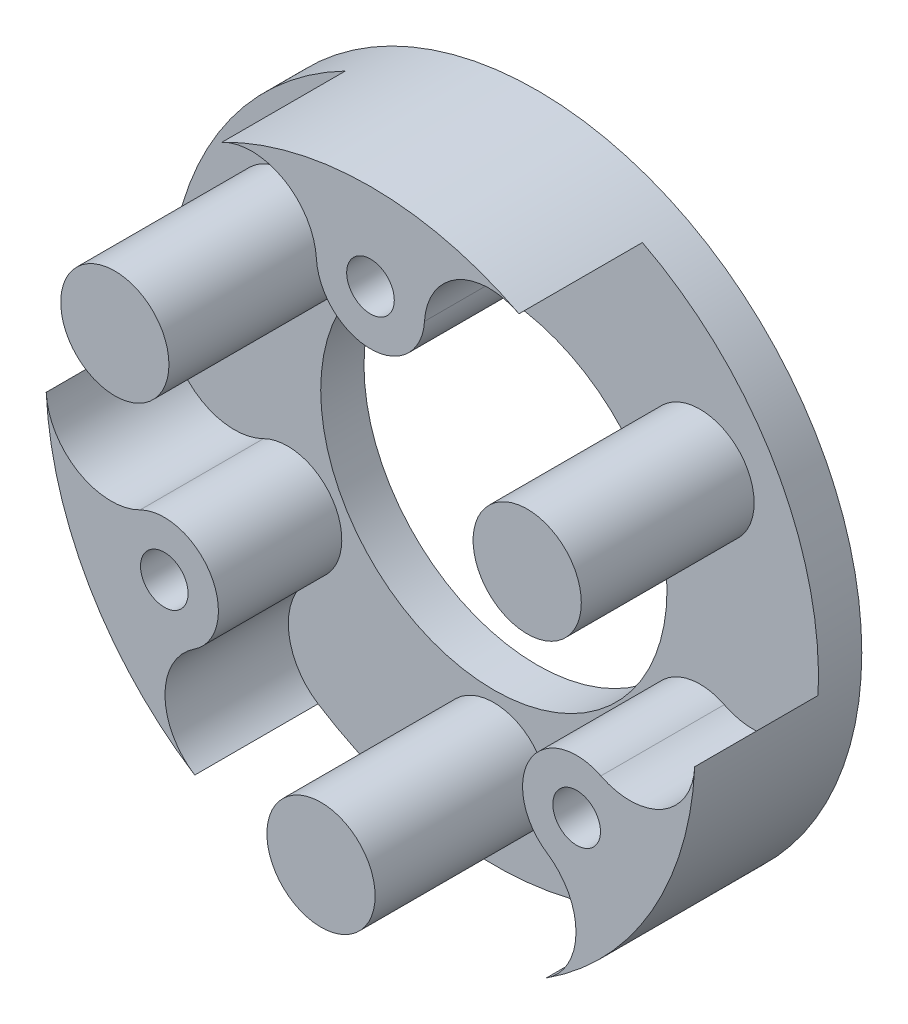
ISO-10303-21;
HEADER;
FILE_DESCRIPTION(('STEP AP214'),'2;1');
FILE_NAME('part.step','',(''),(''),'','','');
FILE_SCHEMA(('AUTOMOTIVE_DESIGN { 1 0 10303 214 1 1 1 1 }'));
ENDSEC;
DATA;
#1=APPLICATION_CONTEXT('core data for automotive mechanical design processes');
#2=APPLICATION_PROTOCOL_DEFINITION('international standard','automotive_design',2000,#1);
#3=PRODUCT_CONTEXT('',#1,'mechanical');
#4=PRODUCT('Part','Part','',(#3));
#5=PRODUCT_RELATED_PRODUCT_CATEGORY('part','',(#4));
#6=PRODUCT_DEFINITION_FORMATION('','',#4);
#7=PRODUCT_DEFINITION_CONTEXT('part definition',#1,'design');
#8=PRODUCT_DEFINITION('design','',#6,#7);
#9=PRODUCT_DEFINITION_SHAPE('','',#8);
#10=(LENGTH_UNIT() NAMED_UNIT(*) SI_UNIT(.MILLI.,.METRE.));
#11=(NAMED_UNIT(*) PLANE_ANGLE_UNIT() SI_UNIT($,.RADIAN.));
#12=(NAMED_UNIT(*) SI_UNIT($,.STERADIAN.) SOLID_ANGLE_UNIT());
#13=UNCERTAINTY_MEASURE_WITH_UNIT(LENGTH_MEASURE(1.E-05),#10,'distance_accuracy_value','');
#14=(GEOMETRIC_REPRESENTATION_CONTEXT(3) GLOBAL_UNCERTAINTY_ASSIGNED_CONTEXT((#13)) GLOBAL_UNIT_ASSIGNED_CONTEXT((#10,
#11,#12)) REPRESENTATION_CONTEXT('',''));
#15=CARTESIAN_POINT('',(0.,0.,0.));
#16=DIRECTION('',(0.,0.,1.));
#17=DIRECTION('',(1.,0.,0.));
#18=AXIS2_PLACEMENT_3D('',#15,#16,#17);
#19=CARTESIAN_POINT('',(0.,0.,2.));
#20=DIRECTION('',(0.,0.,1.));
#21=DIRECTION('',(1.,0.,0.));
#22=AXIS2_PLACEMENT_3D('',#19,#20,#21);
#23=PLANE('',#22);
#24=CARTESIAN_POINT('',(0.,-11.,2.));
#25=DIRECTION('',(0.,0.,1.));
#26=DIRECTION('',(1.,0.,0.));
#27=AXIS2_PLACEMENT_3D('',#24,#25,#26);
#28=CIRCLE('',#27,2.5);
#29=CARTESIAN_POINT('',(2.49999999999998,-11.,2.));
#30=VERTEX_POINT('',#29);
#31=EDGE_CURVE('E225',#30,#30,#28,.T.);
#32=ORIENTED_EDGE('',*,*,#31,.F.);
#33=EDGE_LOOP('',(#32));
#34=FACE_BOUND('',#33,.T.);
#35=CARTESIAN_POINT('',(9.52627944162884,5.49999999999998,2.));
#36=DIRECTION('',(0.,0.,1.));
#37=DIRECTION('',(1.,0.,0.));
#38=AXIS2_PLACEMENT_3D('',#35,#36,#37);
#39=CIRCLE('',#38,2.5);
#40=CARTESIAN_POINT('',(12.0262794416288,5.49999999999998,2.));
#41=VERTEX_POINT('',#40);
#42=EDGE_CURVE('E234',#41,#41,#39,.T.);
#43=ORIENTED_EDGE('',*,*,#42,.F.);
#44=EDGE_LOOP('',(#43));
#45=FACE_BOUND('',#44,.T.);
#46=CARTESIAN_POINT('',(-9.52627944162881,5.50000000000002,2.));
#47=DIRECTION('',(0.,0.,1.));
#48=DIRECTION('',(1.,0.,0.));
#49=AXIS2_PLACEMENT_3D('',#46,#47,#48);
#50=CIRCLE('',#49,2.5);
#51=CARTESIAN_POINT('',(-7.02627944162881,5.50000000000002,2.));
#52=VERTEX_POINT('',#51);
#53=EDGE_CURVE('E243',#52,#52,#50,.T.);
#54=ORIENTED_EDGE('',*,*,#53,.F.);
#55=EDGE_LOOP('',(#54));
#56=FACE_BOUND('',#55,.T.);
#57=CARTESIAN_POINT('',(0.,0.,2.));
#58=DIRECTION('',(0.,0.,1.));
#59=DIRECTION('',(1.,0.,0.));
#60=AXIS2_PLACEMENT_3D('',#57,#58,#59);
#61=CIRCLE('',#60,8.);
#62=CARTESIAN_POINT('',(8.,0.,2.));
#63=VERTEX_POINT('',#62);
#64=EDGE_CURVE('E262',#63,#63,#61,.T.);
#65=ORIENTED_EDGE('',*,*,#64,.F.);
#66=EDGE_LOOP('',(#65));
#67=FACE_BOUND('',#66,.T.);
#68=CARTESIAN_POINT('',(0.,0.,2.));
#69=DIRECTION('',(0.,0.,1.));
#70=DIRECTION('',(1.,0.,0.));
#71=AXIS2_PLACEMENT_3D('',#68,#69,#70);
#72=CIRCLE('',#71,15.);
#73=CARTESIAN_POINT('',(14.9824298684836,-0.725806610585195,2.));
#74=VERTEX_POINT('',#73);
#75=CARTESIAN_POINT('',(6.86264797124036,13.3380681818182,2.));
#76=VERTEX_POINT('',#75);
#77=EDGE_CURVE('E271',#74,#76,#72,.T.);
#78=ORIENTED_EDGE('',*,*,#77,.T.);
#79=CARTESIAN_POINT('',(5.49011837699229,10.6704545454545,2.));
#80=DIRECTION('',(0.,0.,1.));
#81=DIRECTION('',(1.,0.,0.));
#82=AXIS2_PLACEMENT_3D('',#79,#80,#81);
#83=CIRCLE('',#82,3.);
#84=CARTESIAN_POINT('',(2.49550835317831,10.8502066115702,2.));
#85=VERTEX_POINT('',#84);
#86=EDGE_CURVE('E60',#85,#76,#83,.F.);
#87=ORIENTED_EDGE('',*,*,#86,.F.);
#88=CARTESIAN_POINT('',(0.,11.,2.));
#89=DIRECTION('',(0.,0.,1.));
#90=DIRECTION('',(1.,0.,0.));
#91=AXIS2_PLACEMENT_3D('',#88,#89,#90);
#92=CIRCLE('',#91,2.5);
#93=CARTESIAN_POINT('',(-2.49550835317831,10.8502066115702,2.));
#94=VERTEX_POINT('',#93);
#95=EDGE_CURVE('E65',#94,#85,#92,.T.);
#96=ORIENTED_EDGE('',*,*,#95,.F.);
#97=CARTESIAN_POINT('',(-5.49011837699229,10.6704545454545,2.));
#98=DIRECTION('',(0.,0.,1.));
#99=DIRECTION('',(1.,0.,0.));
#100=AXIS2_PLACEMENT_3D('',#97,#98,#99);
#101=CIRCLE('',#100,3.);
#102=CARTESIAN_POINT('',(-6.86264797124036,13.3380681818182,2.));
#103=VERTEX_POINT('',#102);
#104=EDGE_CURVE('E320',#94,#103,#101,.T.);
#105=ORIENTED_EDGE('',*,*,#104,.T.);
#106=CARTESIAN_POINT('',(-14.9824298684836,-0.725806610585196,2.));
#107=VERTEX_POINT('',#106);
#108=EDGE_CURVE('E272',#103,#107,#72,.T.);
#109=ORIENTED_EDGE('',*,*,#108,.T.);
#110=CARTESIAN_POINT('',(-11.9859438947869,-0.580645288468157,2.));
#111=DIRECTION('',(0.,0.,1.));
#112=DIRECTION('',(1.,0.,0.));
#113=AXIS2_PLACEMENT_3D('',#110,#111,#112);
#114=CIRCLE('',#113,3.);
#115=CARTESIAN_POINT('',(-10.6443087385189,-3.26392967657644,2.));
#116=VERTEX_POINT('',#115);
#117=EDGE_CURVE('E197',#116,#107,#114,.F.);
#118=ORIENTED_EDGE('',*,*,#117,.F.);
#119=CARTESIAN_POINT('',(-9.52627944162882,-5.50000000000001,2.));
#120=DIRECTION('',(0.,0.,1.));
#121=DIRECTION('',(1.,0.,0.));
#122=AXIS2_PLACEMENT_3D('',#119,#120,#121);
#123=CIRCLE('',#122,2.5);
#124=CARTESIAN_POINT('',(-8.14880038534055,-7.58627693499382,2.));
#125=VERTEX_POINT('',#124);
#126=EDGE_CURVE('E209',#125,#116,#123,.T.);
#127=ORIENTED_EDGE('',*,*,#126,.F.);
#128=CARTESIAN_POINT('',(-6.49582551779463,-10.0898092569864,2.));
#129=DIRECTION('',(0.,0.,1.));
#130=DIRECTION('',(1.,0.,0.));
#131=AXIS2_PLACEMENT_3D('',#128,#129,#130);
#132=CIRCLE('',#131,3.);
#133=CARTESIAN_POINT('',(-8.11978189724329,-12.612261571233,2.));
#134=VERTEX_POINT('',#133);
#135=EDGE_CURVE('E192',#125,#134,#132,.T.);
#136=ORIENTED_EDGE('',*,*,#135,.T.);
#137=CARTESIAN_POINT('',(8.11978189724329,-12.612261571233,2.));
#138=VERTEX_POINT('',#137);
#139=EDGE_CURVE('E268',#134,#138,#72,.T.);
#140=ORIENTED_EDGE('',*,*,#139,.T.);
#141=CARTESIAN_POINT('',(6.49582551779463,-10.0898092569864,2.));
#142=DIRECTION('',(0.,0.,1.));
#143=DIRECTION('',(1.,0.,0.));
#144=AXIS2_PLACEMENT_3D('',#141,#142,#143);
#145=CIRCLE('',#144,3.);
#146=CARTESIAN_POINT('',(8.14880038534056,-7.58627693499381,2.));
#147=VERTEX_POINT('',#146);
#148=EDGE_CURVE('E167',#147,#138,#145,.F.);
#149=ORIENTED_EDGE('',*,*,#148,.F.);
#150=CARTESIAN_POINT('',(9.52627944162883,-5.5,2.));
#151=DIRECTION('',(0.,0.,1.));
#152=DIRECTION('',(1.,0.,0.));
#153=AXIS2_PLACEMENT_3D('',#150,#151,#152);
#154=CIRCLE('',#153,2.5);
#155=CARTESIAN_POINT('',(10.6443087385189,-3.26392967657643,2.));
#156=VERTEX_POINT('',#155);
#157=EDGE_CURVE('E157',#156,#147,#154,.T.);
#158=ORIENTED_EDGE('',*,*,#157,.F.);
#159=CARTESIAN_POINT('',(11.9859438947869,-0.580645288468156,2.));
#160=DIRECTION('',(0.,0.,1.));
#161=DIRECTION('',(1.,0.,0.));
#162=AXIS2_PLACEMENT_3D('',#159,#160,#161);
#163=CIRCLE('',#162,3.);
#164=EDGE_CURVE('E154',#156,#74,#163,.T.);
#165=ORIENTED_EDGE('',*,*,#164,.T.);
#166=EDGE_LOOP('',(#78,#87,#96,#105,#109,#118,#127,#136,#140,#149,#158,#165));
#167=FACE_BOUND('',#166,.T.);
#168=ADVANCED_FACE('F45',(#34,#45,#56,#67,#167),#23,.T.);
#169=CARTESIAN_POINT('',(0.,0.,0.));
#170=DIRECTION('',(0.,0.,1.));
#171=DIRECTION('',(1.,0.,0.));
#172=AXIS2_PLACEMENT_3D('',#169,#170,#171);
#173=PLANE('',#172);
#174=CARTESIAN_POINT('',(0.,0.,0.));
#175=DIRECTION('',(0.,0.,1.));
#176=DIRECTION('',(1.,0.,0.));
#177=AXIS2_PLACEMENT_3D('',#174,#175,#176);
#178=CIRCLE('',#177,15.);
#179=CARTESIAN_POINT('',(15.,0.,0.));
#180=VERTEX_POINT('',#179);
#181=EDGE_CURVE('E265',#180,#180,#178,.T.);
#182=ORIENTED_EDGE('',*,*,#181,.F.);
#183=EDGE_LOOP('',(#182));
#184=FACE_BOUND('',#183,.T.);
#185=CARTESIAN_POINT('',(0.,0.,0.));
#186=DIRECTION('',(0.,0.,1.));
#187=DIRECTION('',(1.,0.,0.));
#188=AXIS2_PLACEMENT_3D('',#185,#186,#187);
#189=CIRCLE('',#188,8.);
#190=CARTESIAN_POINT('',(8.,0.,0.));
#191=VERTEX_POINT('',#190);
#192=EDGE_CURVE('E261',#191,#191,#189,.T.);
#193=ORIENTED_EDGE('',*,*,#192,.T.);
#194=EDGE_LOOP('',(#193));
#195=FACE_BOUND('',#194,.T.);
#196=CARTESIAN_POINT('',(9.52627944162884,5.49999999999998,0.));
#197=DIRECTION('',(0.,0.,1.));
#198=DIRECTION('',(1.,0.,0.));
#199=AXIS2_PLACEMENT_3D('',#196,#197,#198);
#200=CIRCLE('',#199,1.5);
#201=CARTESIAN_POINT('',(11.0262794416288,5.49999999999998,0.));
#202=VERTEX_POINT('',#201);
#203=EDGE_CURVE('E258',#202,#202,#200,.T.);
#204=ORIENTED_EDGE('',*,*,#203,.T.);
#205=EDGE_LOOP('',(#204));
#206=FACE_BOUND('',#205,.T.);
#207=CARTESIAN_POINT('',(0.,-11.,0.));
#208=DIRECTION('',(0.,0.,1.));
#209=DIRECTION('',(1.,0.,0.));
#210=AXIS2_PLACEMENT_3D('',#207,#208,#209);
#211=CIRCLE('',#210,1.5);
#212=CARTESIAN_POINT('',(1.49999999999998,-11.,0.));
#213=VERTEX_POINT('',#212);
#214=EDGE_CURVE('E255',#213,#213,#211,.T.);
#215=ORIENTED_EDGE('',*,*,#214,.T.);
#216=EDGE_LOOP('',(#215));
#217=FACE_BOUND('',#216,.T.);
#218=CARTESIAN_POINT('',(-9.52627944162881,5.50000000000002,0.));
#219=DIRECTION('',(0.,0.,1.));
#220=DIRECTION('',(1.,0.,0.));
#221=AXIS2_PLACEMENT_3D('',#218,#219,#220);
#222=CIRCLE('',#221,1.5);
#223=CARTESIAN_POINT('',(-8.02627944162881,5.50000000000002,0.));
#224=VERTEX_POINT('',#223);
#225=EDGE_CURVE('E252',#224,#224,#222,.T.);
#226=ORIENTED_EDGE('',*,*,#225,.T.);
#227=EDGE_LOOP('',(#226));
#228=FACE_BOUND('',#227,.T.);
#229=ADVANCED_FACE('F302',(#184,#195,#206,#217,#228),#173,.F.);
#230=CARTESIAN_POINT('',(0.,0.,2.));
#231=DIRECTION('',(0.,0.,-1.));
#232=DIRECTION('',(-1.,0.,0.));
#233=AXIS2_PLACEMENT_3D('',#230,#231,#232);
#234=CYLINDRICAL_SURFACE('',#233,15.);
#235=ORIENTED_EDGE('',*,*,#139,.F.);
#236=DIRECTION('',(0.,0.,-1.));
#237=VECTOR('',#236,1.);
#238=CARTESIAN_POINT('',(-8.11978189724329,-12.612261571233,7.7));
#239=LINE('',#238,#237);
#240=CARTESIAN_POINT('',(-8.11978189724329,-12.612261571233,7.7));
#241=VERTEX_POINT('',#240);
#242=EDGE_CURVE('E206',#241,#134,#239,.T.);
#243=ORIENTED_EDGE('',*,*,#242,.F.);
#244=CARTESIAN_POINT('',(0.,0.,7.7));
#245=DIRECTION('',(0.,0.,1.));
#246=DIRECTION('',(1.,0.,0.));
#247=AXIS2_PLACEMENT_3D('',#244,#245,#246);
#248=CIRCLE('',#247,15.);
#249=CARTESIAN_POINT('',(-14.9824298684836,-0.725806610585196,7.7));
#250=VERTEX_POINT('',#249);
#251=EDGE_CURVE('E201',#250,#241,#248,.T.);
#252=ORIENTED_EDGE('',*,*,#251,.F.);
#253=DIRECTION('',(0.,0.,-1.));
#254=VECTOR('',#253,1.);
#255=CARTESIAN_POINT('',(-14.9824298684836,-0.725806610585196,7.7));
#256=LINE('',#255,#254);
#257=EDGE_CURVE('E216',#250,#107,#256,.T.);
#258=ORIENTED_EDGE('',*,*,#257,.T.);
#259=ORIENTED_EDGE('',*,*,#108,.F.);
#260=DIRECTION('',(0.,0.,-1.));
#261=VECTOR('',#260,1.);
#262=CARTESIAN_POINT('',(-6.86264797124036,13.3380681818182,7.7));
#263=LINE('',#262,#261);
#264=CARTESIAN_POINT('',(-6.86264797124036,13.3380681818182,7.7));
#265=VERTEX_POINT('',#264);
#266=EDGE_CURVE('E159',#265,#103,#263,.T.);
#267=ORIENTED_EDGE('',*,*,#266,.F.);
#268=CARTESIAN_POINT('',(0.,0.,7.7));
#269=DIRECTION('',(0.,0.,1.));
#270=DIRECTION('',(1.,0.,0.));
#271=AXIS2_PLACEMENT_3D('',#268,#269,#270);
#272=CIRCLE('',#271,15.);
#273=CARTESIAN_POINT('',(6.86264797124036,13.3380681818182,7.7));
#274=VERTEX_POINT('',#273);
#275=EDGE_CURVE('E142',#274,#265,#272,.T.);
#276=ORIENTED_EDGE('',*,*,#275,.F.);
#277=DIRECTION('',(0.,0.,-1.));
#278=VECTOR('',#277,1.);
#279=CARTESIAN_POINT('',(6.86264797124036,13.3380681818182,7.7));
#280=LINE('',#279,#278);
#281=EDGE_CURVE('E139',#274,#76,#280,.T.);
#282=ORIENTED_EDGE('',*,*,#281,.T.);
#283=ORIENTED_EDGE('',*,*,#77,.F.);
#284=DIRECTION('',(0.,0.,-1.));
#285=VECTOR('',#284,1.);
#286=CARTESIAN_POINT('',(14.9824298684836,-0.725806610585195,7.7));
#287=LINE('',#286,#285);
#288=CARTESIAN_POINT('',(14.9824298684836,-0.725806610585195,7.7));
#289=VERTEX_POINT('',#288);
#290=EDGE_CURVE('E175',#289,#74,#287,.T.);
#291=ORIENTED_EDGE('',*,*,#290,.F.);
#292=CARTESIAN_POINT('',(0.,0.,7.7));
#293=DIRECTION('',(0.,0.,1.));
#294=DIRECTION('',(1.,0.,0.));
#295=AXIS2_PLACEMENT_3D('',#292,#293,#294);
#296=CIRCLE('',#295,15.);
#297=CARTESIAN_POINT('',(8.11978189724329,-12.612261571233,7.7));
#298=VERTEX_POINT('',#297);
#299=EDGE_CURVE('E171',#298,#289,#296,.T.);
#300=ORIENTED_EDGE('',*,*,#299,.F.);
#301=DIRECTION('',(0.,0.,-1.));
#302=VECTOR('',#301,1.);
#303=CARTESIAN_POINT('',(8.11978189724329,-12.612261571233,7.7));
#304=LINE('',#303,#302);
#305=EDGE_CURVE('E183',#298,#138,#304,.T.);
#306=ORIENTED_EDGE('',*,*,#305,.T.);
#307=EDGE_LOOP('',(#235,#243,#252,#258,#259,#267,#276,#282,#283,#291,#300,#306));
#308=FACE_BOUND('',#307,.T.);
#309=ORIENTED_EDGE('',*,*,#181,.T.);
#310=EDGE_LOOP('',(#309));
#311=FACE_BOUND('',#310,.T.);
#312=ADVANCED_FACE('F47',(#308,#311),#234,.T.);
#313=CARTESIAN_POINT('',(0.,0.,2.));
#314=DIRECTION('',(0.,0.,-1.));
#315=DIRECTION('',(-1.,0.,0.));
#316=AXIS2_PLACEMENT_3D('',#313,#314,#315);
#317=CYLINDRICAL_SURFACE('',#316,8.);
#318=ORIENTED_EDGE('',*,*,#64,.T.);
#319=EDGE_LOOP('',(#318));
#320=FACE_BOUND('',#319,.T.);
#321=ORIENTED_EDGE('',*,*,#192,.F.);
#322=EDGE_LOOP('',(#321));
#323=FACE_BOUND('',#322,.T.);
#324=ADVANCED_FACE('F403',(#320,#323),#317,.F.);
#325=CARTESIAN_POINT('',(9.52627944162884,5.49999999999998,2.));
#326=DIRECTION('',(0.,0.,-1.));
#327=DIRECTION('',(-1.,0.,0.));
#328=AXIS2_PLACEMENT_3D('',#325,#326,#327);
#329=CYLINDRICAL_SURFACE('',#328,1.5);
#330=CARTESIAN_POINT('',(9.52627944162884,5.49999999999998,2.));
#331=DIRECTION('',(0.,0.,1.));
#332=DIRECTION('',(1.,0.,0.));
#333=AXIS2_PLACEMENT_3D('',#330,#331,#332);
#334=CIRCLE('',#333,1.5);
#335=CARTESIAN_POINT('',(11.0262794416288,5.49999999999998,2.));
#336=VERTEX_POINT('',#335);
#337=EDGE_CURVE('E238',#336,#336,#334,.T.);
#338=ORIENTED_EDGE('',*,*,#337,.T.);
#339=EDGE_LOOP('',(#338));
#340=FACE_BOUND('',#339,.T.);
#341=ORIENTED_EDGE('',*,*,#203,.F.);
#342=EDGE_LOOP('',(#341));
#343=FACE_BOUND('',#342,.T.);
#344=ADVANCED_FACE('F400',(#340,#343),#329,.F.);
#345=CARTESIAN_POINT('',(0.,-11.,2.));
#346=DIRECTION('',(0.,0.,-1.));
#347=DIRECTION('',(-1.,0.,0.));
#348=AXIS2_PLACEMENT_3D('',#345,#346,#347);
#349=CYLINDRICAL_SURFACE('',#348,1.5);
#350=CARTESIAN_POINT('',(0.,-11.,2.));
#351=DIRECTION('',(0.,0.,1.));
#352=DIRECTION('',(1.,0.,0.));
#353=AXIS2_PLACEMENT_3D('',#350,#351,#352);
#354=CIRCLE('',#353,1.5);
#355=CARTESIAN_POINT('',(1.49999999999998,-11.,2.));
#356=VERTEX_POINT('',#355);
#357=EDGE_CURVE('E229',#356,#356,#354,.T.);
#358=ORIENTED_EDGE('',*,*,#357,.T.);
#359=EDGE_LOOP('',(#358));
#360=FACE_BOUND('',#359,.T.);
#361=ORIENTED_EDGE('',*,*,#214,.F.);
#362=EDGE_LOOP('',(#361));
#363=FACE_BOUND('',#362,.T.);
#364=ADVANCED_FACE('F396',(#360,#363),#349,.F.);
#365=CARTESIAN_POINT('',(-9.52627944162881,5.50000000000002,2.));
#366=DIRECTION('',(0.,0.,-1.));
#367=DIRECTION('',(-1.,0.,0.));
#368=AXIS2_PLACEMENT_3D('',#365,#366,#367);
#369=CYLINDRICAL_SURFACE('',#368,1.5);
#370=CARTESIAN_POINT('',(-9.52627944162881,5.50000000000002,2.));
#371=DIRECTION('',(0.,0.,1.));
#372=DIRECTION('',(1.,0.,0.));
#373=AXIS2_PLACEMENT_3D('',#370,#371,#372);
#374=CIRCLE('',#373,1.5);
#375=CARTESIAN_POINT('',(-8.02627944162881,5.50000000000002,2.));
#376=VERTEX_POINT('',#375);
#377=EDGE_CURVE('E247',#376,#376,#374,.T.);
#378=ORIENTED_EDGE('',*,*,#377,.T.);
#379=EDGE_LOOP('',(#378));
#380=FACE_BOUND('',#379,.T.);
#381=ORIENTED_EDGE('',*,*,#225,.F.);
#382=EDGE_LOOP('',(#381));
#383=FACE_BOUND('',#382,.T.);
#384=ADVANCED_FACE('F389',(#380,#383),#369,.F.);
#385=CARTESIAN_POINT('',(0.,0.,2.));
#386=DIRECTION('',(0.,0.,1.));
#387=DIRECTION('',(1.,0.,0.));
#388=AXIS2_PLACEMENT_3D('',#385,#386,#387);
#389=PLANE('',#388);
#390=ORIENTED_EDGE('',*,*,#377,.F.);
#391=EDGE_LOOP('',(#390));
#392=FACE_BOUND('',#391,.T.);
#393=ADVANCED_FACE('F386',(#392),#389,.F.);
#394=CARTESIAN_POINT('',(-9.52627944162881,5.50000000000002,9.98561911570283));
#395=DIRECTION('',(0.,0.,-1.));
#396=DIRECTION('',(-1.,0.,0.));
#397=AXIS2_PLACEMENT_3D('',#394,#395,#396);
#398=CYLINDRICAL_SURFACE('',#397,2.5);
#399=CARTESIAN_POINT('',(-9.52627944162881,5.50000000000002,9.98561911570283));
#400=DIRECTION('',(0.,0.,1.));
#401=DIRECTION('',(1.,0.,0.));
#402=AXIS2_PLACEMENT_3D('',#399,#400,#401);
#403=CIRCLE('',#402,2.5);
#404=CARTESIAN_POINT('',(-7.02627944162881,5.50000000000002,9.98561911570283));
#405=VERTEX_POINT('',#404);
#406=EDGE_CURVE('E244',#405,#405,#403,.T.);
#407=ORIENTED_EDGE('',*,*,#406,.F.);
#408=EDGE_LOOP('',(#407));
#409=FACE_BOUND('',#408,.T.);
#410=ORIENTED_EDGE('',*,*,#53,.T.);
#411=EDGE_LOOP('',(#410));
#412=FACE_BOUND('',#411,.T.);
#413=ADVANCED_FACE('F384',(#409,#412),#398,.T.);
#414=CARTESIAN_POINT('',(0.,0.,9.98561911570283));
#415=DIRECTION('',(0.,0.,1.));
#416=DIRECTION('',(1.,0.,0.));
#417=AXIS2_PLACEMENT_3D('',#414,#415,#416);
#418=PLANE('',#417);
#419=ORIENTED_EDGE('',*,*,#406,.T.);
#420=EDGE_LOOP('',(#419));
#421=FACE_BOUND('',#420,.T.);
#422=ADVANCED_FACE('F377',(#421),#418,.T.);
#423=CARTESIAN_POINT('',(0.,0.,2.));
#424=DIRECTION('',(0.,0.,1.));
#425=DIRECTION('',(1.,0.,0.));
#426=AXIS2_PLACEMENT_3D('',#423,#424,#425);
#427=PLANE('',#426);
#428=ORIENTED_EDGE('',*,*,#337,.F.);
#429=EDGE_LOOP('',(#428));
#430=FACE_BOUND('',#429,.T.);
#431=ADVANCED_FACE('F374',(#430),#427,.F.);
#432=CARTESIAN_POINT('',(9.52627944162884,5.49999999999998,9.98561911570283));
#433=DIRECTION('',(0.,0.,-1.));
#434=DIRECTION('',(-1.,0.,0.));
#435=AXIS2_PLACEMENT_3D('',#432,#433,#434);
#436=CYLINDRICAL_SURFACE('',#435,2.5);
#437=CARTESIAN_POINT('',(9.52627944162884,5.49999999999998,9.98561911570283));
#438=DIRECTION('',(0.,0.,1.));
#439=DIRECTION('',(1.,0.,0.));
#440=AXIS2_PLACEMENT_3D('',#437,#438,#439);
#441=CIRCLE('',#440,2.5);
#442=CARTESIAN_POINT('',(12.0262794416288,5.49999999999998,9.98561911570283));
#443=VERTEX_POINT('',#442);
#444=EDGE_CURVE('E235',#443,#443,#441,.T.);
#445=ORIENTED_EDGE('',*,*,#444,.F.);
#446=EDGE_LOOP('',(#445));
#447=FACE_BOUND('',#446,.T.);
#448=ORIENTED_EDGE('',*,*,#42,.T.);
#449=EDGE_LOOP('',(#448));
#450=FACE_BOUND('',#449,.T.);
#451=ADVANCED_FACE('F372',(#447,#450),#436,.T.);
#452=CARTESIAN_POINT('',(0.,0.,9.98561911570283));
#453=DIRECTION('',(0.,0.,1.));
#454=DIRECTION('',(1.,0.,0.));
#455=AXIS2_PLACEMENT_3D('',#452,#453,#454);
#456=PLANE('',#455);
#457=ORIENTED_EDGE('',*,*,#444,.T.);
#458=EDGE_LOOP('',(#457));
#459=FACE_BOUND('',#458,.T.);
#460=ADVANCED_FACE('F365',(#459),#456,.T.);
#461=CARTESIAN_POINT('',(0.,0.,2.));
#462=DIRECTION('',(0.,0.,1.));
#463=DIRECTION('',(1.,0.,0.));
#464=AXIS2_PLACEMENT_3D('',#461,#462,#463);
#465=PLANE('',#464);
#466=ORIENTED_EDGE('',*,*,#357,.F.);
#467=EDGE_LOOP('',(#466));
#468=FACE_BOUND('',#467,.T.);
#469=ADVANCED_FACE('F362',(#468),#465,.F.);
#470=CARTESIAN_POINT('',(0.,-11.,9.98561911570283));
#471=DIRECTION('',(0.,0.,-1.));
#472=DIRECTION('',(-1.,0.,0.));
#473=AXIS2_PLACEMENT_3D('',#470,#471,#472);
#474=CYLINDRICAL_SURFACE('',#473,2.5);
#475=CARTESIAN_POINT('',(0.,-11.,9.98561911570283));
#476=DIRECTION('',(0.,0.,1.));
#477=DIRECTION('',(1.,0.,0.));
#478=AXIS2_PLACEMENT_3D('',#475,#476,#477);
#479=CIRCLE('',#478,2.5);
#480=CARTESIAN_POINT('',(2.49999999999998,-11.,9.98561911570283));
#481=VERTEX_POINT('',#480);
#482=EDGE_CURVE('E226',#481,#481,#479,.T.);
#483=ORIENTED_EDGE('',*,*,#482,.F.);
#484=EDGE_LOOP('',(#483));
#485=FACE_BOUND('',#484,.T.);
#486=ORIENTED_EDGE('',*,*,#31,.T.);
#487=EDGE_LOOP('',(#486));
#488=FACE_BOUND('',#487,.T.);
#489=ADVANCED_FACE('F357',(#485,#488),#474,.T.);
#490=CARTESIAN_POINT('',(0.,0.,9.98561911570283));
#491=DIRECTION('',(0.,0.,1.));
#492=DIRECTION('',(1.,0.,0.));
#493=AXIS2_PLACEMENT_3D('',#490,#491,#492);
#494=PLANE('',#493);
#495=ORIENTED_EDGE('',*,*,#482,.T.);
#496=EDGE_LOOP('',(#495));
#497=FACE_BOUND('',#496,.T.);
#498=ADVANCED_FACE('F351',(#497),#494,.T.);
#499=CARTESIAN_POINT('',(-6.49582551779463,-10.0898092569864,7.7));
#500=DIRECTION('',(0.,0.,-1.));
#501=DIRECTION('',(-1.,0.,0.));
#502=AXIS2_PLACEMENT_3D('',#499,#500,#501);
#503=CYLINDRICAL_SURFACE('',#502,3.);
#504=ORIENTED_EDGE('',*,*,#135,.F.);
#505=DIRECTION('',(0.,0.,-1.));
#506=VECTOR('',#505,1.);
#507=CARTESIAN_POINT('',(-8.14880038534055,-7.58627693499382,7.7));
#508=LINE('',#507,#506);
#509=CARTESIAN_POINT('',(-8.14880038534055,-7.58627693499382,7.7));
#510=VERTEX_POINT('',#509);
#511=EDGE_CURVE('E222',#510,#125,#508,.T.);
#512=ORIENTED_EDGE('',*,*,#511,.F.);
#513=CARTESIAN_POINT('',(-6.49582551779463,-10.0898092569864,7.7));
#514=DIRECTION('',(0.,0.,1.));
#515=DIRECTION('',(1.,0.,0.));
#516=AXIS2_PLACEMENT_3D('',#513,#514,#515);
#517=CIRCLE('',#516,3.);
#518=EDGE_CURVE('E193',#510,#241,#517,.T.);
#519=ORIENTED_EDGE('',*,*,#518,.T.);
#520=ORIENTED_EDGE('',*,*,#242,.T.);
#521=EDGE_LOOP('',(#504,#512,#519,#520));
#522=FACE_BOUND('',#521,.T.);
#523=ADVANCED_FACE('F349',(#522),#503,.F.);
#524=CARTESIAN_POINT('',(-9.52627944162882,-5.50000000000001,7.7));
#525=DIRECTION('',(0.,0.,-1.));
#526=DIRECTION('',(-1.,0.,0.));
#527=AXIS2_PLACEMENT_3D('',#524,#525,#526);
#528=CYLINDRICAL_SURFACE('',#527,2.5);
#529=ORIENTED_EDGE('',*,*,#126,.T.);
#530=DIRECTION('',(0.,0.,-1.));
#531=VECTOR('',#530,1.);
#532=CARTESIAN_POINT('',(-10.6443087385189,-3.26392967657644,7.7));
#533=LINE('',#532,#531);
#534=CARTESIAN_POINT('',(-10.6443087385189,-3.26392967657644,7.7));
#535=VERTEX_POINT('',#534);
#536=EDGE_CURVE('E219',#535,#116,#533,.T.);
#537=ORIENTED_EDGE('',*,*,#536,.F.);
#538=CARTESIAN_POINT('',(-9.52627944162882,-5.50000000000001,7.7));
#539=DIRECTION('',(0.,0.,1.));
#540=DIRECTION('',(1.,0.,0.));
#541=AXIS2_PLACEMENT_3D('',#538,#539,#540);
#542=CIRCLE('',#541,2.5);
#543=EDGE_CURVE('E196',#510,#535,#542,.T.);
#544=ORIENTED_EDGE('',*,*,#543,.F.);
#545=ORIENTED_EDGE('',*,*,#511,.T.);
#546=EDGE_LOOP('',(#529,#537,#544,#545));
#547=FACE_BOUND('',#546,.T.);
#548=ADVANCED_FACE('F346',(#547),#528,.T.);
#549=CARTESIAN_POINT('',(-11.9859438947869,-0.580645288468157,7.7));
#550=DIRECTION('',(0.,0.,-1.));
#551=DIRECTION('',(-1.,0.,0.));
#552=AXIS2_PLACEMENT_3D('',#549,#550,#551);
#553=CYLINDRICAL_SURFACE('',#552,3.);
#554=ORIENTED_EDGE('',*,*,#117,.T.);
#555=ORIENTED_EDGE('',*,*,#257,.F.);
#556=CARTESIAN_POINT('',(-11.9859438947869,-0.580645288468157,7.7));
#557=DIRECTION('',(0.,0.,1.));
#558=DIRECTION('',(1.,0.,0.));
#559=AXIS2_PLACEMENT_3D('',#556,#557,#558);
#560=CIRCLE('',#559,3.);
#561=EDGE_CURVE('E199',#535,#250,#560,.F.);
#562=ORIENTED_EDGE('',*,*,#561,.F.);
#563=ORIENTED_EDGE('',*,*,#536,.T.);
#564=EDGE_LOOP('',(#554,#555,#562,#563));
#565=FACE_BOUND('',#564,.T.);
#566=ADVANCED_FACE('F336',(#565),#553,.F.);
#567=CARTESIAN_POINT('',(-9.52627944162882,-5.50000000000001,7.7));
#568=DIRECTION('',(0.,0.,-1.));
#569=DIRECTION('',(-1.,0.,0.));
#570=AXIS2_PLACEMENT_3D('',#567,#568,#569);
#571=CYLINDRICAL_SURFACE('',#570,1.1);
#572=CARTESIAN_POINT('',(-9.52627944162882,-5.50000000000001,7.7));
#573=DIRECTION('',(0.,0.,1.));
#574=DIRECTION('',(1.,0.,0.));
#575=AXIS2_PLACEMENT_3D('',#572,#573,#574);
#576=CIRCLE('',#575,1.1);
#577=CARTESIAN_POINT('',(-8.42627944162882,-5.50000000000001,7.7));
#578=VERTEX_POINT('',#577);
#579=EDGE_CURVE('E203',#578,#578,#576,.T.);
#580=ORIENTED_EDGE('',*,*,#579,.T.);
#581=EDGE_LOOP('',(#580));
#582=FACE_BOUND('',#581,.T.);
#583=CARTESIAN_POINT('',(-9.52627944162882,-5.50000000000001,2.));
#584=DIRECTION('',(0.,0.,1.));
#585=DIRECTION('',(1.,0.,0.));
#586=AXIS2_PLACEMENT_3D('',#583,#584,#585);
#587=CIRCLE('',#586,1.1);
#588=CARTESIAN_POINT('',(-8.42627944162882,-5.50000000000001,2.));
#589=VERTEX_POINT('',#588);
#590=EDGE_CURVE('E270',#589,#589,#587,.F.);
#591=ORIENTED_EDGE('',*,*,#590,.T.);
#592=EDGE_LOOP('',(#591));
#593=FACE_BOUND('',#592,.T.);
#594=ADVANCED_FACE('F446',(#582,#593),#571,.F.);
#595=CARTESIAN_POINT('',(0.,0.,7.7));
#596=DIRECTION('',(0.,0.,1.));
#597=DIRECTION('',(1.,0.,0.));
#598=AXIS2_PLACEMENT_3D('',#595,#596,#597);
#599=PLANE('',#598);
#600=ORIENTED_EDGE('',*,*,#518,.F.);
#601=ORIENTED_EDGE('',*,*,#543,.T.);
#602=ORIENTED_EDGE('',*,*,#561,.T.);
#603=ORIENTED_EDGE('',*,*,#251,.T.);
#604=EDGE_LOOP('',(#600,#601,#602,#603));
#605=FACE_BOUND('',#604,.T.);
#606=ORIENTED_EDGE('',*,*,#579,.F.);
#607=EDGE_LOOP('',(#606));
#608=FACE_BOUND('',#607,.T.);
#609=ADVANCED_FACE('F297',(#605,#608),#599,.T.);
#610=ORIENTED_EDGE('',*,*,#590,.F.);
#611=EDGE_LOOP('',(#610));
#612=FACE_BOUND('',#611,.T.);
#613=ADVANCED_FACE('F285',(#612),#23,.T.);
#614=CARTESIAN_POINT('',(11.9859438947869,-0.580645288468156,7.7));
#615=DIRECTION('',(0.,0.,-1.));
#616=DIRECTION('',(-1.,0.,0.));
#617=AXIS2_PLACEMENT_3D('',#614,#615,#616);
#618=CYLINDRICAL_SURFACE('',#617,3.);
#619=ORIENTED_EDGE('',*,*,#164,.F.);
#620=DIRECTION('',(0.,0.,-1.));
#621=VECTOR('',#620,1.);
#622=CARTESIAN_POINT('',(10.6443087385189,-3.26392967657643,7.7));
#623=LINE('',#622,#621);
#624=CARTESIAN_POINT('',(10.6443087385189,-3.26392967657643,7.7));
#625=VERTEX_POINT('',#624);
#626=EDGE_CURVE('E189',#625,#156,#623,.T.);
#627=ORIENTED_EDGE('',*,*,#626,.F.);
#628=CARTESIAN_POINT('',(11.9859438947869,-0.580645288468156,7.7));
#629=DIRECTION('',(0.,0.,1.));
#630=DIRECTION('',(1.,0.,0.));
#631=AXIS2_PLACEMENT_3D('',#628,#629,#630);
#632=CIRCLE('',#631,3.);
#633=EDGE_CURVE('E163',#625,#289,#632,.T.);
#634=ORIENTED_EDGE('',*,*,#633,.T.);
#635=ORIENTED_EDGE('',*,*,#290,.T.);
#636=EDGE_LOOP('',(#619,#627,#634,#635));
#637=FACE_BOUND('',#636,.T.);
#638=ADVANCED_FACE('F296',(#637),#618,.F.);
#639=CARTESIAN_POINT('',(9.52627944162883,-5.5,7.7));
#640=DIRECTION('',(0.,0.,-1.));
#641=DIRECTION('',(-1.,0.,0.));
#642=AXIS2_PLACEMENT_3D('',#639,#640,#641);
#643=CYLINDRICAL_SURFACE('',#642,2.5);
#644=ORIENTED_EDGE('',*,*,#157,.T.);
#645=DIRECTION('',(0.,0.,-1.));
#646=VECTOR('',#645,1.);
#647=CARTESIAN_POINT('',(8.14880038534056,-7.58627693499381,7.7));
#648=LINE('',#647,#646);
#649=CARTESIAN_POINT('',(8.14880038534056,-7.58627693499381,7.7));
#650=VERTEX_POINT('',#649);
#651=EDGE_CURVE('E186',#650,#147,#648,.T.);
#652=ORIENTED_EDGE('',*,*,#651,.F.);
#653=CARTESIAN_POINT('',(9.52627944162883,-5.5,7.7));
#654=DIRECTION('',(0.,0.,1.));
#655=DIRECTION('',(1.,0.,0.));
#656=AXIS2_PLACEMENT_3D('',#653,#654,#655);
#657=CIRCLE('',#656,2.5);
#658=EDGE_CURVE('E166',#625,#650,#657,.T.);
#659=ORIENTED_EDGE('',*,*,#658,.F.);
#660=ORIENTED_EDGE('',*,*,#626,.T.);
#661=EDGE_LOOP('',(#644,#652,#659,#660));
#662=FACE_BOUND('',#661,.T.);
#663=ADVANCED_FACE('F471',(#662),#643,.T.);
#664=CARTESIAN_POINT('',(6.49582551779463,-10.0898092569864,7.7));
#665=DIRECTION('',(0.,0.,-1.));
#666=DIRECTION('',(-1.,0.,0.));
#667=AXIS2_PLACEMENT_3D('',#664,#665,#666);
#668=CYLINDRICAL_SURFACE('',#667,3.);
#669=ORIENTED_EDGE('',*,*,#148,.T.);
#670=ORIENTED_EDGE('',*,*,#305,.F.);
#671=CARTESIAN_POINT('',(6.49582551779463,-10.0898092569864,7.7));
#672=DIRECTION('',(0.,0.,1.));
#673=DIRECTION('',(1.,0.,0.));
#674=AXIS2_PLACEMENT_3D('',#671,#672,#673);
#675=CIRCLE('',#674,3.);
#676=EDGE_CURVE('E169',#650,#298,#675,.F.);
#677=ORIENTED_EDGE('',*,*,#676,.F.);
#678=ORIENTED_EDGE('',*,*,#651,.T.);
#679=EDGE_LOOP('',(#669,#670,#677,#678));
#680=FACE_BOUND('',#679,.T.);
#681=ADVANCED_FACE('F481',(#680),#668,.F.);
#682=CARTESIAN_POINT('',(9.52627944162883,-5.5,7.7));
#683=DIRECTION('',(0.,0.,-1.));
#684=DIRECTION('',(-1.,0.,0.));
#685=AXIS2_PLACEMENT_3D('',#682,#683,#684);
#686=CYLINDRICAL_SURFACE('',#685,1.1);
#687=CARTESIAN_POINT('',(9.52627944162883,-5.5,7.7));
#688=DIRECTION('',(0.,0.,1.));
#689=DIRECTION('',(1.,0.,0.));
#690=AXIS2_PLACEMENT_3D('',#687,#688,#689);
#691=CIRCLE('',#690,1.1);
#692=CARTESIAN_POINT('',(10.6262794416288,-5.5,7.7));
#693=VERTEX_POINT('',#692);
#694=EDGE_CURVE('E173',#693,#693,#691,.T.);
#695=ORIENTED_EDGE('',*,*,#694,.T.);
#696=EDGE_LOOP('',(#695));
#697=FACE_BOUND('',#696,.T.);
#698=CARTESIAN_POINT('',(9.52627944162883,-5.5,2.));
#699=DIRECTION('',(0.,0.,1.));
#700=DIRECTION('',(1.,0.,0.));
#701=AXIS2_PLACEMENT_3D('',#698,#699,#700);
#702=CIRCLE('',#701,1.1);
#703=CARTESIAN_POINT('',(10.6262794416288,-5.5,2.));
#704=VERTEX_POINT('',#703);
#705=EDGE_CURVE('E53',#704,#704,#702,.F.);
#706=ORIENTED_EDGE('',*,*,#705,.T.);
#707=EDGE_LOOP('',(#706));
#708=FACE_BOUND('',#707,.T.);
#709=ADVANCED_FACE('F279',(#697,#708),#686,.F.);
#710=CARTESIAN_POINT('',(0.,0.,7.7));
#711=DIRECTION('',(0.,0.,1.));
#712=DIRECTION('',(1.,0.,0.));
#713=AXIS2_PLACEMENT_3D('',#710,#711,#712);
#714=PLANE('',#713);
#715=ORIENTED_EDGE('',*,*,#633,.F.);
#716=ORIENTED_EDGE('',*,*,#658,.T.);
#717=ORIENTED_EDGE('',*,*,#676,.T.);
#718=ORIENTED_EDGE('',*,*,#299,.T.);
#719=EDGE_LOOP('',(#715,#716,#717,#718));
#720=FACE_BOUND('',#719,.T.);
#721=ORIENTED_EDGE('',*,*,#694,.F.);
#722=EDGE_LOOP('',(#721));
#723=FACE_BOUND('',#722,.T.);
#724=ADVANCED_FACE('F283',(#720,#723),#714,.T.);
#725=ORIENTED_EDGE('',*,*,#705,.F.);
#726=EDGE_LOOP('',(#725));
#727=FACE_BOUND('',#726,.T.);
#728=ADVANCED_FACE('F281',(#727),#23,.T.);
#729=CARTESIAN_POINT('',(0.,11.,7.7));
#730=DIRECTION('',(0.,0.,-1.));
#731=DIRECTION('',(-1.,0.,0.));
#732=AXIS2_PLACEMENT_3D('',#729,#730,#731);
#733=CYLINDRICAL_SURFACE('',#732,2.5);
#734=ORIENTED_EDGE('',*,*,#95,.T.);
#735=DIRECTION('',(0.,0.,-1.));
#736=VECTOR('',#735,1.);
#737=CARTESIAN_POINT('',(2.49550835317831,10.8502066115702,7.7));
#738=LINE('',#737,#736);
#739=CARTESIAN_POINT('',(2.49550835317831,10.8502066115702,7.7));
#740=VERTEX_POINT('',#739);
#741=EDGE_CURVE('E137',#740,#85,#738,.T.);
#742=ORIENTED_EDGE('',*,*,#741,.F.);
#743=CARTESIAN_POINT('',(0.,11.,7.7));
#744=DIRECTION('',(0.,0.,1.));
#745=DIRECTION('',(1.,0.,0.));
#746=AXIS2_PLACEMENT_3D('',#743,#744,#745);
#747=CIRCLE('',#746,2.5);
#748=CARTESIAN_POINT('',(-2.49550835317831,10.8502066115702,7.7));
#749=VERTEX_POINT('',#748);
#750=EDGE_CURVE('E143',#749,#740,#747,.T.);
#751=ORIENTED_EDGE('',*,*,#750,.F.);
#752=DIRECTION('',(0.,0.,-1.));
#753=VECTOR('',#752,1.);
#754=CARTESIAN_POINT('',(-2.49550835317831,10.8502066115702,7.7));
#755=LINE('',#754,#753);
#756=EDGE_CURVE('E326',#749,#94,#755,.T.);
#757=ORIENTED_EDGE('',*,*,#756,.T.);
#758=EDGE_LOOP('',(#734,#742,#751,#757));
#759=FACE_BOUND('',#758,.T.);
#760=ADVANCED_FACE('F153',(#759),#733,.T.);
#761=CARTESIAN_POINT('',(5.49011837699229,10.6704545454545,7.7));
#762=DIRECTION('',(0.,0.,-1.));
#763=DIRECTION('',(-1.,0.,0.));
#764=AXIS2_PLACEMENT_3D('',#761,#762,#763);
#765=CYLINDRICAL_SURFACE('',#764,3.);
#766=ORIENTED_EDGE('',*,*,#86,.T.);
#767=ORIENTED_EDGE('',*,*,#281,.F.);
#768=CARTESIAN_POINT('',(5.49011837699229,10.6704545454545,7.7));
#769=DIRECTION('',(0.,0.,1.));
#770=DIRECTION('',(1.,0.,0.));
#771=AXIS2_PLACEMENT_3D('',#768,#769,#770);
#772=CIRCLE('',#771,3.);
#773=EDGE_CURVE('E133',#740,#274,#772,.F.);
#774=ORIENTED_EDGE('',*,*,#773,.F.);
#775=ORIENTED_EDGE('',*,*,#741,.T.);
#776=EDGE_LOOP('',(#766,#767,#774,#775));
#777=FACE_BOUND('',#776,.T.);
#778=ADVANCED_FACE('F135',(#777),#765,.F.);
#779=CARTESIAN_POINT('',(0.,11.,7.7));
#780=DIRECTION('',(0.,0.,-1.));
#781=DIRECTION('',(-1.,0.,0.));
#782=AXIS2_PLACEMENT_3D('',#779,#780,#781);
#783=CYLINDRICAL_SURFACE('',#782,1.1);
#784=CARTESIAN_POINT('',(0.,11.,7.7));
#785=DIRECTION('',(0.,0.,1.));
#786=DIRECTION('',(1.,0.,0.));
#787=AXIS2_PLACEMENT_3D('',#784,#785,#786);
#788=CIRCLE('',#787,1.1);
#789=CARTESIAN_POINT('',(1.1,11.,7.7));
#790=VERTEX_POINT('',#789);
#791=EDGE_CURVE('E151',#790,#790,#788,.T.);
#792=ORIENTED_EDGE('',*,*,#791,.T.);
#793=EDGE_LOOP('',(#792));
#794=FACE_BOUND('',#793,.T.);
#795=CARTESIAN_POINT('',(0.,11.,2.));
#796=DIRECTION('',(0.,0.,1.));
#797=DIRECTION('',(1.,0.,0.));
#798=AXIS2_PLACEMENT_3D('',#795,#796,#797);
#799=CIRCLE('',#798,1.1);
#800=CARTESIAN_POINT('',(1.1,11.,2.));
#801=VERTEX_POINT('',#800);
#802=EDGE_CURVE('E11',#801,#801,#799,.F.);
#803=ORIENTED_EDGE('',*,*,#802,.T.);
#804=EDGE_LOOP('',(#803));
#805=FACE_BOUND('',#804,.T.);
#806=ADVANCED_FACE('F521',(#794,#805),#783,.F.);
#807=CARTESIAN_POINT('',(-5.49011837699229,10.6704545454545,7.7));
#808=DIRECTION('',(0.,0.,-1.));
#809=DIRECTION('',(-1.,0.,0.));
#810=AXIS2_PLACEMENT_3D('',#807,#808,#809);
#811=CYLINDRICAL_SURFACE('',#810,3.);
#812=ORIENTED_EDGE('',*,*,#104,.F.);
#813=ORIENTED_EDGE('',*,*,#756,.F.);
#814=CARTESIAN_POINT('',(-5.49011837699229,10.6704545454545,7.7));
#815=DIRECTION('',(0.,0.,1.));
#816=DIRECTION('',(1.,0.,0.));
#817=AXIS2_PLACEMENT_3D('',#814,#815,#816);
#818=CIRCLE('',#817,3.);
#819=EDGE_CURVE('E149',#749,#265,#818,.T.);
#820=ORIENTED_EDGE('',*,*,#819,.T.);
#821=ORIENTED_EDGE('',*,*,#266,.T.);
#822=EDGE_LOOP('',(#812,#813,#820,#821));
#823=FACE_BOUND('',#822,.T.);
#824=ADVANCED_FACE('F333',(#823),#811,.F.);
#825=CARTESIAN_POINT('',(0.,0.,7.7));
#826=DIRECTION('',(0.,0.,1.));
#827=DIRECTION('',(1.,0.,0.));
#828=AXIS2_PLACEMENT_3D('',#825,#826,#827);
#829=PLANE('',#828);
#830=ORIENTED_EDGE('',*,*,#791,.F.);
#831=EDGE_LOOP('',(#830));
#832=FACE_BOUND('',#831,.T.);
#833=ORIENTED_EDGE('',*,*,#750,.T.);
#834=ORIENTED_EDGE('',*,*,#773,.T.);
#835=ORIENTED_EDGE('',*,*,#275,.T.);
#836=ORIENTED_EDGE('',*,*,#819,.F.);
#837=EDGE_LOOP('',(#833,#834,#835,#836));
#838=FACE_BOUND('',#837,.T.);
#839=ADVANCED_FACE('F147',(#832,#838),#829,.T.);
#840=ORIENTED_EDGE('',*,*,#802,.F.);
#841=EDGE_LOOP('',(#840));
#842=FACE_BOUND('',#841,.T.);
#843=ADVANCED_FACE('F286',(#842),#23,.T.);
#844=CLOSED_SHELL('',(#168,#229,#312,#324,#344,#364,#384,#393,#413,#422,#431,#451,#460,#469,
#489,#498,#523,#548,#566,#594,#609,#613,#638,#663,#681,#709,#724,#728,#760,#778,#806,#824,#839,#843));
#845=MANIFOLD_SOLID_BREP('B2',#844);
#846=ADVANCED_BREP_SHAPE_REPRESENTATION('',(#18,#845),#14);
#847=SHAPE_DEFINITION_REPRESENTATION(#9,#846);
ENDSEC;
END-ISO-10303-21;
